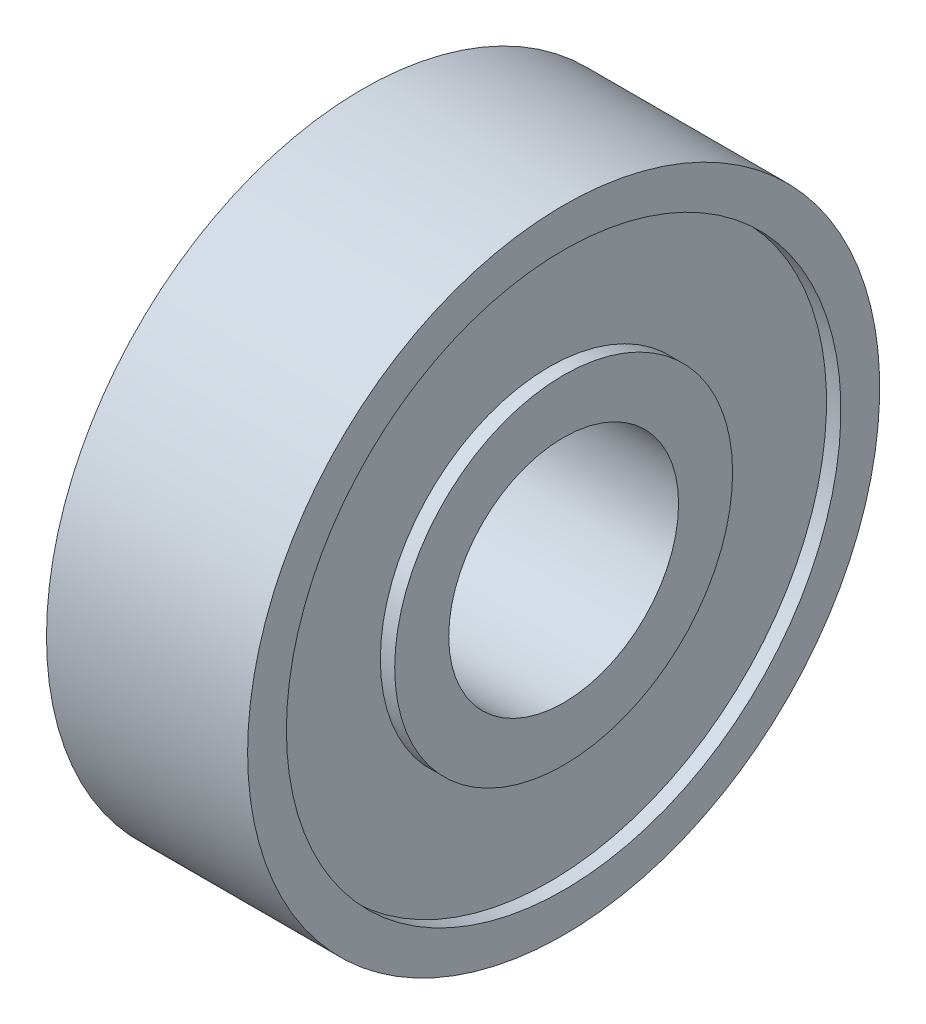
ISO-10303-21;
HEADER;
FILE_DESCRIPTION(('STEP AP214'),'2;1');
FILE_NAME('part.step','',(''),(''),'','','');
FILE_SCHEMA(('AUTOMOTIVE_DESIGN { 1 0 10303 214 1 1 1 1 }'));
ENDSEC;
DATA;
#1=APPLICATION_CONTEXT('core data for automotive mechanical design processes');
#2=APPLICATION_PROTOCOL_DEFINITION('international standard','automotive_design',2000,#1);
#3=PRODUCT_CONTEXT('',#1,'mechanical');
#4=PRODUCT('Part','Part','',(#3));
#5=PRODUCT_RELATED_PRODUCT_CATEGORY('part','',(#4));
#6=PRODUCT_DEFINITION_FORMATION('','',#4);
#7=PRODUCT_DEFINITION_CONTEXT('part definition',#1,'design');
#8=PRODUCT_DEFINITION('design','',#6,#7);
#9=PRODUCT_DEFINITION_SHAPE('','',#8);
#10=(LENGTH_UNIT() NAMED_UNIT(*) SI_UNIT(.MILLI.,.METRE.));
#11=(NAMED_UNIT(*) PLANE_ANGLE_UNIT() SI_UNIT($,.RADIAN.));
#12=(NAMED_UNIT(*) SI_UNIT($,.STERADIAN.) SOLID_ANGLE_UNIT());
#13=UNCERTAINTY_MEASURE_WITH_UNIT(LENGTH_MEASURE(1.E-05),#10,'distance_accuracy_value','');
#14=(GEOMETRIC_REPRESENTATION_CONTEXT(3) GLOBAL_UNCERTAINTY_ASSIGNED_CONTEXT((#13)) GLOBAL_UNIT_ASSIGNED_CONTEXT((#10,
#11,#12)) REPRESENTATION_CONTEXT('',''));
#15=CARTESIAN_POINT('',(0.,0.,0.));
#16=DIRECTION('',(0.,0.,1.));
#17=DIRECTION('',(1.,0.,0.));
#18=AXIS2_PLACEMENT_3D('',#15,#16,#17);
#19=CARTESIAN_POINT('',(3.5,0.,-11.));
#20=DIRECTION('',(-1.,0.,0.));
#21=DIRECTION('',(0.,0.,1.));
#22=AXIS2_PLACEMENT_3D('',#19,#20,#21);
#23=PLANE('',#22);
#24=CARTESIAN_POINT('',(3.5,0.,0.));
#25=DIRECTION('',(-1.,0.,0.));
#26=DIRECTION('',(0.,0.,1.));
#27=AXIS2_PLACEMENT_3D('',#24,#25,#26);
#28=CIRCLE('',#27,11.);
#29=CARTESIAN_POINT('',(3.5,0.,11.));
#30=VERTEX_POINT('',#29);
#31=EDGE_CURVE('E10',#30,#30,#28,.T.);
#32=ORIENTED_EDGE('',*,*,#31,.F.);
#33=EDGE_LOOP('',(#32));
#34=FACE_BOUND('',#33,.T.);
#35=CARTESIAN_POINT('',(3.5,0.,0.));
#36=DIRECTION('',(-1.,0.,0.));
#37=DIRECTION('',(0.,0.,1.));
#38=AXIS2_PLACEMENT_3D('',#35,#36,#37);
#39=CIRCLE('',#38,9.65);
#40=CARTESIAN_POINT('',(3.5,0.,9.65));
#41=VERTEX_POINT('',#40);
#42=EDGE_CURVE('E75',#41,#41,#39,.T.);
#43=ORIENTED_EDGE('',*,*,#42,.T.);
#44=EDGE_LOOP('',(#43));
#45=FACE_BOUND('',#44,.T.);
#46=ADVANCED_FACE('F35',(#34,#45),#23,.F.);
#47=CARTESIAN_POINT('',(0.,0.,0.));
#48=DIRECTION('',(-1.,0.,0.));
#49=DIRECTION('',(0.,0.,1.));
#50=AXIS2_PLACEMENT_3D('',#47,#48,#49);
#51=CYLINDRICAL_SURFACE('',#50,11.);
#52=CARTESIAN_POINT('',(-3.5,0.,0.));
#53=DIRECTION('',(-1.,0.,0.));
#54=DIRECTION('',(0.,0.,1.));
#55=AXIS2_PLACEMENT_3D('',#52,#53,#54);
#56=CIRCLE('',#55,11.);
#57=CARTESIAN_POINT('',(-3.5,0.,11.));
#58=VERTEX_POINT('',#57);
#59=EDGE_CURVE('E41',#58,#58,#56,.T.);
#60=ORIENTED_EDGE('',*,*,#59,.F.);
#61=EDGE_LOOP('',(#60));
#62=FACE_BOUND('',#61,.T.);
#63=ORIENTED_EDGE('',*,*,#31,.T.);
#64=EDGE_LOOP('',(#63));
#65=FACE_BOUND('',#64,.T.);
#66=ADVANCED_FACE('F136',(#62,#65),#51,.T.);
#67=CARTESIAN_POINT('',(-3.5,0.,-11.));
#68=DIRECTION('',(1.,0.,0.));
#69=DIRECTION('',(0.,0.,-1.));
#70=AXIS2_PLACEMENT_3D('',#67,#68,#69);
#71=PLANE('',#70);
#72=CARTESIAN_POINT('',(-3.5,0.,0.));
#73=DIRECTION('',(-1.,0.,0.));
#74=DIRECTION('',(0.,0.,1.));
#75=AXIS2_PLACEMENT_3D('',#72,#73,#74);
#76=CIRCLE('',#75,9.65);
#77=CARTESIAN_POINT('',(-3.5,0.,9.65));
#78=VERTEX_POINT('',#77);
#79=EDGE_CURVE('E45',#78,#78,#76,.T.);
#80=ORIENTED_EDGE('',*,*,#79,.F.);
#81=EDGE_LOOP('',(#80));
#82=FACE_BOUND('',#81,.T.);
#83=ORIENTED_EDGE('',*,*,#59,.T.);
#84=EDGE_LOOP('',(#83));
#85=FACE_BOUND('',#84,.T.);
#86=ADVANCED_FACE('F131',(#82,#85),#71,.F.);
#87=CARTESIAN_POINT('',(0.,0.,0.));
#88=DIRECTION('',(-1.,0.,0.));
#89=DIRECTION('',(0.,0.,1.));
#90=AXIS2_PLACEMENT_3D('',#87,#88,#89);
#91=CYLINDRICAL_SURFACE('',#90,9.65);
#92=CARTESIAN_POINT('',(-3.,0.,0.));
#93=DIRECTION('',(-1.,0.,0.));
#94=DIRECTION('',(0.,0.,1.));
#95=AXIS2_PLACEMENT_3D('',#92,#93,#94);
#96=CIRCLE('',#95,9.65);
#97=CARTESIAN_POINT('',(-3.,0.,9.65));
#98=VERTEX_POINT('',#97);
#99=EDGE_CURVE('E49',#98,#98,#96,.T.);
#100=ORIENTED_EDGE('',*,*,#99,.F.);
#101=EDGE_LOOP('',(#100));
#102=FACE_BOUND('',#101,.T.);
#103=ORIENTED_EDGE('',*,*,#79,.T.);
#104=EDGE_LOOP('',(#103));
#105=FACE_BOUND('',#104,.T.);
#106=ADVANCED_FACE('F125',(#102,#105),#91,.F.);
#107=CARTESIAN_POINT('',(-3.,0.,-9.65000000000001));
#108=DIRECTION('',(1.,0.,0.));
#109=DIRECTION('',(0.,0.,-1.));
#110=AXIS2_PLACEMENT_3D('',#107,#108,#109);
#111=PLANE('',#110);
#112=CARTESIAN_POINT('',(-3.,0.,0.));
#113=DIRECTION('',(-1.,0.,0.));
#114=DIRECTION('',(0.,0.,1.));
#115=AXIS2_PLACEMENT_3D('',#112,#113,#114);
#116=CIRCLE('',#115,5.88);
#117=CARTESIAN_POINT('',(-3.,0.,5.88));
#118=VERTEX_POINT('',#117);
#119=EDGE_CURVE('E54',#118,#118,#116,.T.);
#120=ORIENTED_EDGE('',*,*,#119,.F.);
#121=EDGE_LOOP('',(#120));
#122=FACE_BOUND('',#121,.T.);
#123=ORIENTED_EDGE('',*,*,#99,.T.);
#124=EDGE_LOOP('',(#123));
#125=FACE_BOUND('',#124,.T.);
#126=ADVANCED_FACE('F119',(#122,#125),#111,.F.);
#127=CARTESIAN_POINT('',(0.,0.,0.));
#128=DIRECTION('',(-1.,0.,0.));
#129=DIRECTION('',(0.,0.,1.));
#130=AXIS2_PLACEMENT_3D('',#127,#128,#129);
#131=CYLINDRICAL_SURFACE('',#130,5.88);
#132=CARTESIAN_POINT('',(-3.5,0.,0.));
#133=DIRECTION('',(-1.,0.,0.));
#134=DIRECTION('',(0.,0.,1.));
#135=AXIS2_PLACEMENT_3D('',#132,#133,#134);
#136=CIRCLE('',#135,5.88);
#137=CARTESIAN_POINT('',(-3.5,0.,5.88));
#138=VERTEX_POINT('',#137);
#139=EDGE_CURVE('E57',#138,#138,#136,.T.);
#140=ORIENTED_EDGE('',*,*,#139,.F.);
#141=EDGE_LOOP('',(#140));
#142=FACE_BOUND('',#141,.T.);
#143=ORIENTED_EDGE('',*,*,#119,.T.);
#144=EDGE_LOOP('',(#143));
#145=FACE_BOUND('',#144,.T.);
#146=ADVANCED_FACE('F113',(#142,#145),#131,.T.);
#147=CARTESIAN_POINT('',(-3.5,0.,-5.88));
#148=DIRECTION('',(1.,0.,0.));
#149=DIRECTION('',(0.,0.,-1.));
#150=AXIS2_PLACEMENT_3D('',#147,#148,#149);
#151=PLANE('',#150);
#152=CARTESIAN_POINT('',(-3.5,0.,0.));
#153=DIRECTION('',(-1.,0.,0.));
#154=DIRECTION('',(0.,0.,1.));
#155=AXIS2_PLACEMENT_3D('',#152,#153,#154);
#156=CIRCLE('',#155,4.);
#157=CARTESIAN_POINT('',(-3.5,0.,4.));
#158=VERTEX_POINT('',#157);
#159=EDGE_CURVE('E60',#158,#158,#156,.T.);
#160=ORIENTED_EDGE('',*,*,#159,.F.);
#161=EDGE_LOOP('',(#160));
#162=FACE_BOUND('',#161,.T.);
#163=ORIENTED_EDGE('',*,*,#139,.T.);
#164=EDGE_LOOP('',(#163));
#165=FACE_BOUND('',#164,.T.);
#166=ADVANCED_FACE('F107',(#162,#165),#151,.F.);
#167=CARTESIAN_POINT('',(0.,0.,0.));
#168=DIRECTION('',(-1.,0.,0.));
#169=DIRECTION('',(0.,0.,1.));
#170=AXIS2_PLACEMENT_3D('',#167,#168,#169);
#171=CYLINDRICAL_SURFACE('',#170,4.);
#172=CARTESIAN_POINT('',(3.5,0.,0.));
#173=DIRECTION('',(-1.,0.,0.));
#174=DIRECTION('',(0.,0.,1.));
#175=AXIS2_PLACEMENT_3D('',#172,#173,#174);
#176=CIRCLE('',#175,4.);
#177=CARTESIAN_POINT('',(3.5,0.,4.));
#178=VERTEX_POINT('',#177);
#179=EDGE_CURVE('E63',#178,#178,#176,.T.);
#180=ORIENTED_EDGE('',*,*,#179,.F.);
#181=EDGE_LOOP('',(#180));
#182=FACE_BOUND('',#181,.T.);
#183=ORIENTED_EDGE('',*,*,#159,.T.);
#184=EDGE_LOOP('',(#183));
#185=FACE_BOUND('',#184,.T.);
#186=ADVANCED_FACE('F101',(#182,#185),#171,.F.);
#187=CARTESIAN_POINT('',(3.5,0.,-5.88));
#188=DIRECTION('',(-1.,0.,0.));
#189=DIRECTION('',(0.,0.,1.));
#190=AXIS2_PLACEMENT_3D('',#187,#188,#189);
#191=PLANE('',#190);
#192=CARTESIAN_POINT('',(3.5,0.,0.));
#193=DIRECTION('',(-1.,0.,0.));
#194=DIRECTION('',(0.,0.,1.));
#195=AXIS2_PLACEMENT_3D('',#192,#193,#194);
#196=CIRCLE('',#195,5.88);
#197=CARTESIAN_POINT('',(3.5,0.,5.88));
#198=VERTEX_POINT('',#197);
#199=EDGE_CURVE('E66',#198,#198,#196,.T.);
#200=ORIENTED_EDGE('',*,*,#199,.F.);
#201=EDGE_LOOP('',(#200));
#202=FACE_BOUND('',#201,.T.);
#203=ORIENTED_EDGE('',*,*,#179,.T.);
#204=EDGE_LOOP('',(#203));
#205=FACE_BOUND('',#204,.T.);
#206=ADVANCED_FACE('F95',(#202,#205),#191,.F.);
#207=CARTESIAN_POINT('',(0.,0.,0.));
#208=DIRECTION('',(-1.,0.,0.));
#209=DIRECTION('',(0.,0.,1.));
#210=AXIS2_PLACEMENT_3D('',#207,#208,#209);
#211=CYLINDRICAL_SURFACE('',#210,5.88);
#212=CARTESIAN_POINT('',(3.,0.,0.));
#213=DIRECTION('',(-1.,0.,0.));
#214=DIRECTION('',(0.,0.,1.));
#215=AXIS2_PLACEMENT_3D('',#212,#213,#214);
#216=CIRCLE('',#215,5.88);
#217=CARTESIAN_POINT('',(3.,0.,5.88));
#218=VERTEX_POINT('',#217);
#219=EDGE_CURVE('E69',#218,#218,#216,.T.);
#220=ORIENTED_EDGE('',*,*,#219,.F.);
#221=EDGE_LOOP('',(#220));
#222=FACE_BOUND('',#221,.T.);
#223=ORIENTED_EDGE('',*,*,#199,.T.);
#224=EDGE_LOOP('',(#223));
#225=FACE_BOUND('',#224,.T.);
#226=ADVANCED_FACE('F89',(#222,#225),#211,.T.);
#227=CARTESIAN_POINT('',(3.,0.,-9.65000000000001));
#228=DIRECTION('',(-1.,0.,0.));
#229=DIRECTION('',(0.,0.,1.));
#230=AXIS2_PLACEMENT_3D('',#227,#228,#229);
#231=PLANE('',#230);
#232=CARTESIAN_POINT('',(3.,0.,0.));
#233=DIRECTION('',(-1.,0.,0.));
#234=DIRECTION('',(0.,0.,1.));
#235=AXIS2_PLACEMENT_3D('',#232,#233,#234);
#236=CIRCLE('',#235,9.65);
#237=CARTESIAN_POINT('',(3.,0.,9.65));
#238=VERTEX_POINT('',#237);
#239=EDGE_CURVE('E72',#238,#238,#236,.T.);
#240=ORIENTED_EDGE('',*,*,#239,.F.);
#241=EDGE_LOOP('',(#240));
#242=FACE_BOUND('',#241,.T.);
#243=ORIENTED_EDGE('',*,*,#219,.T.);
#244=EDGE_LOOP('',(#243));
#245=FACE_BOUND('',#244,.T.);
#246=ADVANCED_FACE('F83',(#242,#245),#231,.F.);
#247=CARTESIAN_POINT('',(0.,0.,0.));
#248=DIRECTION('',(-1.,0.,0.));
#249=DIRECTION('',(0.,0.,1.));
#250=AXIS2_PLACEMENT_3D('',#247,#248,#249);
#251=CYLINDRICAL_SURFACE('',#250,9.65);
#252=ORIENTED_EDGE('',*,*,#42,.F.);
#253=EDGE_LOOP('',(#252));
#254=FACE_BOUND('',#253,.T.);
#255=ORIENTED_EDGE('',*,*,#239,.T.);
#256=EDGE_LOOP('',(#255));
#257=FACE_BOUND('',#256,.T.);
#258=ADVANCED_FACE('F80',(#254,#257),#251,.F.);
#259=CLOSED_SHELL('',(#46,#66,#86,#106,#126,#146,#166,#186,#206,#226,#246,#258));
#260=MANIFOLD_SOLID_BREP('B2',#259);
#261=ADVANCED_BREP_SHAPE_REPRESENTATION('',(#18,#260),#14);
#262=SHAPE_DEFINITION_REPRESENTATION(#9,#261);
ENDSEC;
END-ISO-10303-21;
